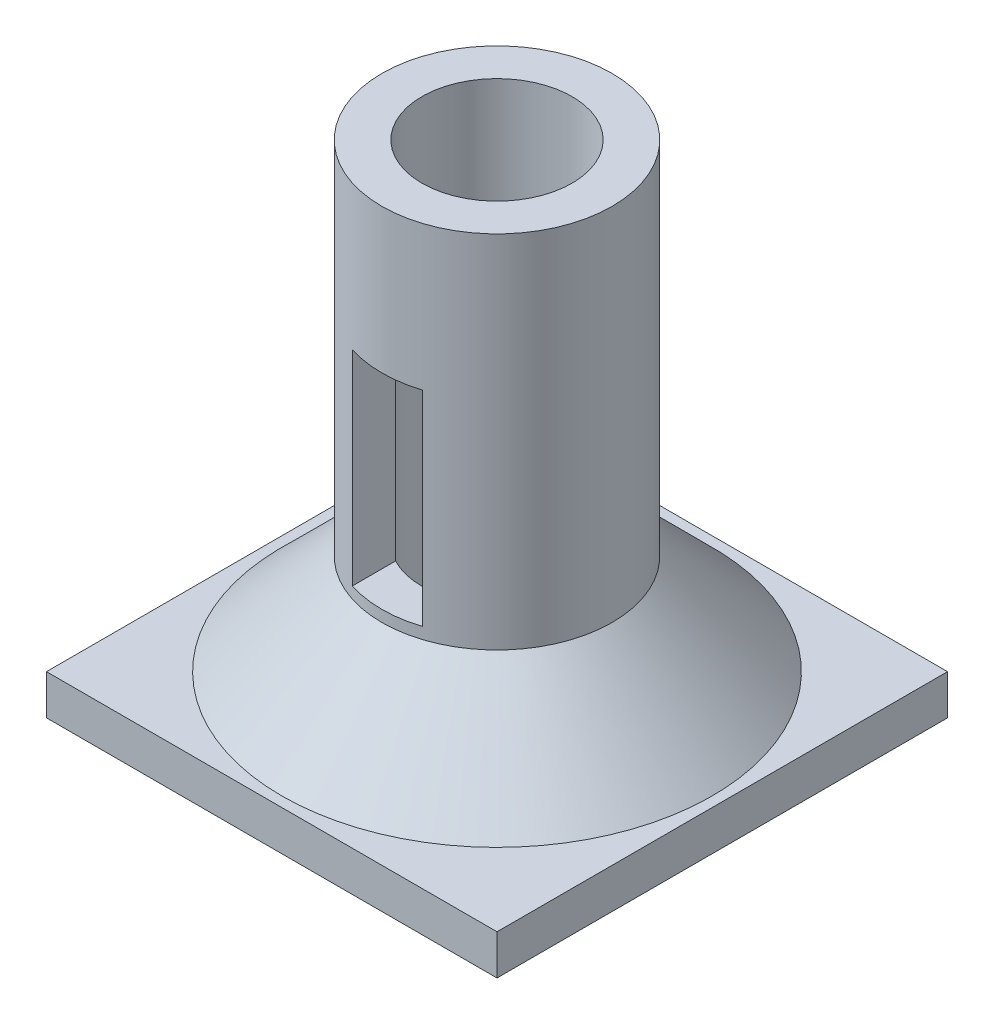
ISO-10303-21;
HEADER;
FILE_DESCRIPTION(('STEP AP214'),'2;1');
FILE_NAME('part.step','',(''),(''),'','','');
FILE_SCHEMA(('AUTOMOTIVE_DESIGN { 1 0 10303 214 1 1 1 1 }'));
ENDSEC;
DATA;
#1=APPLICATION_CONTEXT('core data for automotive mechanical design processes');
#2=APPLICATION_PROTOCOL_DEFINITION('international standard','automotive_design',2000,#1);
#3=PRODUCT_CONTEXT('',#1,'mechanical');
#4=PRODUCT('Part','Part','',(#3));
#5=PRODUCT_RELATED_PRODUCT_CATEGORY('part','',(#4));
#6=PRODUCT_DEFINITION_FORMATION('','',#4);
#7=PRODUCT_DEFINITION_CONTEXT('part definition',#1,'design');
#8=PRODUCT_DEFINITION('design','',#6,#7);
#9=PRODUCT_DEFINITION_SHAPE('','',#8);
#10=(LENGTH_UNIT() NAMED_UNIT(*) SI_UNIT(.MILLI.,.METRE.));
#11=(NAMED_UNIT(*) PLANE_ANGLE_UNIT() SI_UNIT($,.RADIAN.));
#12=(NAMED_UNIT(*) SI_UNIT($,.STERADIAN.) SOLID_ANGLE_UNIT());
#13=UNCERTAINTY_MEASURE_WITH_UNIT(LENGTH_MEASURE(1.E-05),#10,'distance_accuracy_value','');
#14=(GEOMETRIC_REPRESENTATION_CONTEXT(3) GLOBAL_UNCERTAINTY_ASSIGNED_CONTEXT((#13)) GLOBAL_UNIT_ASSIGNED_CONTEXT((#10,
#11,#12)) REPRESENTATION_CONTEXT('',''));
#15=CARTESIAN_POINT('',(0.,0.,0.));
#16=DIRECTION('',(0.,0.,1.));
#17=DIRECTION('',(1.,0.,0.));
#18=AXIS2_PLACEMENT_3D('',#15,#16,#17);
#19=CARTESIAN_POINT('',(0.,46.,0.));
#20=DIRECTION('',(0.,-1.,0.));
#21=DIRECTION('',(0.,0.,-1.));
#22=AXIS2_PLACEMENT_3D('',#19,#20,#21);
#23=CYLINDRICAL_SURFACE('',#22,7.5);
#24=CARTESIAN_POINT('',(0.,46.,0.));
#25=DIRECTION('',(0.,1.,0.));
#26=DIRECTION('',(0.,0.,1.));
#27=AXIS2_PLACEMENT_3D('',#24,#25,#26);
#28=CIRCLE('',#27,7.5);
#29=CARTESIAN_POINT('',(0.,46.,7.5));
#30=VERTEX_POINT('',#29);
#31=EDGE_CURVE('E163',#30,#30,#28,.T.);
#32=ORIENTED_EDGE('',*,*,#31,.T.);
#33=EDGE_LOOP('',(#32));
#34=FACE_BOUND('',#33,.T.);
#35=CARTESIAN_POINT('',(0.,0.,0.));
#36=DIRECTION('',(0.,1.,0.));
#37=DIRECTION('',(0.,0.,1.));
#38=AXIS2_PLACEMENT_3D('',#35,#36,#37);
#39=CIRCLE('',#38,7.5);
#40=CARTESIAN_POINT('',(0.,0.,7.5));
#41=VERTEX_POINT('',#40);
#42=EDGE_CURVE('E127',#41,#41,#39,.F.);
#43=ORIENTED_EDGE('',*,*,#42,.T.);
#44=EDGE_LOOP('',(#43));
#45=FACE_BOUND('',#44,.T.);
#46=CARTESIAN_POINT('',(0.,31.5880539918233,0.));
#47=DIRECTION('',(0.,-1.,0.));
#48=DIRECTION('',(1.,0.,0.));
#49=AXIS2_PLACEMENT_3D('',#46,#47,#48);
#50=CIRCLE('',#49,7.5);
#51=CARTESIAN_POINT('',(3.5,31.5880539918233,6.6332495807108));
#52=VERTEX_POINT('',#51);
#53=CARTESIAN_POINT('',(-3.5,31.5880539918233,6.6332495807108));
#54=VERTEX_POINT('',#53);
#55=EDGE_CURVE('E173',#52,#54,#50,.T.);
#56=ORIENTED_EDGE('',*,*,#55,.T.);
#57=DIRECTION('',(0.,-1.,0.));
#58=VECTOR('',#57,1.);
#59=CARTESIAN_POINT('',(-3.5,46.,6.6332495807108));
#60=LINE('',#59,#58);
#61=CARTESIAN_POINT('',(-3.5,11.1371551856989,6.6332495807108));
#62=VERTEX_POINT('',#61);
#63=EDGE_CURVE('E112',#54,#62,#60,.T.);
#64=ORIENTED_EDGE('',*,*,#63,.T.);
#65=CARTESIAN_POINT('',(0.,11.1371551856989,0.));
#66=DIRECTION('',(0.,1.,0.));
#67=DIRECTION('',(0.,0.,1.));
#68=AXIS2_PLACEMENT_3D('',#65,#66,#67);
#69=CIRCLE('',#68,7.5);
#70=CARTESIAN_POINT('',(3.5,11.1371551856989,6.6332495807108));
#71=VERTEX_POINT('',#70);
#72=EDGE_CURVE('E167',#62,#71,#69,.T.);
#73=ORIENTED_EDGE('',*,*,#72,.T.);
#74=DIRECTION('',(0.,-1.,0.));
#75=VECTOR('',#74,1.);
#76=CARTESIAN_POINT('',(3.5,46.,6.6332495807108));
#77=LINE('',#76,#75);
#78=EDGE_CURVE('E170',#71,#52,#77,.F.);
#79=ORIENTED_EDGE('',*,*,#78,.T.);
#80=EDGE_LOOP('',(#56,#64,#73,#79));
#81=FACE_BOUND('',#80,.T.);
#82=ADVANCED_FACE('F37',(#34,#45,#81),#23,.F.);
#83=CARTESIAN_POINT('',(0.,46.,0.));
#84=DIRECTION('',(0.,-1.,0.));
#85=DIRECTION('',(0.,0.,-1.));
#86=AXIS2_PLACEMENT_3D('',#83,#84,#85);
#87=CYLINDRICAL_SURFACE('',#86,11.5);
#88=CARTESIAN_POINT('',(0.,46.,0.));
#89=DIRECTION('',(0.,1.,0.));
#90=DIRECTION('',(0.,0.,1.));
#91=AXIS2_PLACEMENT_3D('',#88,#89,#90);
#92=CIRCLE('',#91,11.5);
#93=CARTESIAN_POINT('',(0.,46.,11.5));
#94=VERTEX_POINT('',#93);
#95=EDGE_CURVE('E152',#94,#94,#92,.T.);
#96=ORIENTED_EDGE('',*,*,#95,.F.);
#97=EDGE_LOOP('',(#96));
#98=FACE_BOUND('',#97,.T.);
#99=CARTESIAN_POINT('',(0.,10.0000000000001,0.));
#100=DIRECTION('',(0.,1.,0.));
#101=DIRECTION('',(0.,0.,1.));
#102=AXIS2_PLACEMENT_3D('',#99,#100,#101);
#103=CIRCLE('',#102,11.5);
#104=CARTESIAN_POINT('',(0.,10.0000000000001,11.5));
#105=VERTEX_POINT('',#104);
#106=EDGE_CURVE('E124',#105,#105,#103,.T.);
#107=ORIENTED_EDGE('',*,*,#106,.T.);
#108=EDGE_LOOP('',(#107));
#109=FACE_BOUND('',#108,.T.);
#110=DIRECTION('',(0.,-1.,0.));
#111=VECTOR('',#110,1.);
#112=CARTESIAN_POINT('',(-3.5,46.,10.9544511501033));
#113=LINE('',#112,#111);
#114=CARTESIAN_POINT('',(-3.5,31.5880539918233,10.9544511501033));
#115=VERTEX_POINT('',#114);
#116=CARTESIAN_POINT('',(-3.5,11.1371551856989,10.9544511501033));
#117=VERTEX_POINT('',#116);
#118=EDGE_CURVE('E11',#115,#117,#113,.T.);
#119=ORIENTED_EDGE('',*,*,#118,.F.);
#120=CARTESIAN_POINT('',(0.,31.5880539918233,0.));
#121=DIRECTION('',(0.,-1.,0.));
#122=DIRECTION('',(1.,0.,0.));
#123=AXIS2_PLACEMENT_3D('',#120,#121,#122);
#124=CIRCLE('',#123,11.5);
#125=CARTESIAN_POINT('',(3.5,31.5880539918233,10.9544511501033));
#126=VERTEX_POINT('',#125);
#127=EDGE_CURVE('E99',#126,#115,#124,.T.);
#128=ORIENTED_EDGE('',*,*,#127,.F.);
#129=DIRECTION('',(0.,-1.,0.));
#130=VECTOR('',#129,1.);
#131=CARTESIAN_POINT('',(3.5,46.,10.9544511501033));
#132=LINE('',#131,#130);
#133=CARTESIAN_POINT('',(3.5,11.1371551856989,10.9544511501033));
#134=VERTEX_POINT('',#133);
#135=EDGE_CURVE('E104',#134,#126,#132,.F.);
#136=ORIENTED_EDGE('',*,*,#135,.F.);
#137=CARTESIAN_POINT('',(0.,11.1371551856989,0.));
#138=DIRECTION('',(0.,1.,0.));
#139=DIRECTION('',(0.,0.,1.));
#140=AXIS2_PLACEMENT_3D('',#137,#138,#139);
#141=CIRCLE('',#140,11.5);
#142=EDGE_CURVE('E46',#117,#134,#141,.T.);
#143=ORIENTED_EDGE('',*,*,#142,.F.);
#144=EDGE_LOOP('',(#119,#128,#136,#143));
#145=FACE_BOUND('',#144,.T.);
#146=ADVANCED_FACE('F116',(#98,#109,#145),#87,.T.);
#147=CARTESIAN_POINT('',(22.5,-4.,0.));
#148=DIRECTION('',(-1.,0.,0.));
#149=DIRECTION('',(0.,0.,1.));
#150=AXIS2_PLACEMENT_3D('',#147,#148,#149);
#151=PLANE('',#150);
#152=DIRECTION('',(0.,0.,1.));
#153=VECTOR('',#152,1.);
#154=CARTESIAN_POINT('',(22.5,0.,0.));
#155=LINE('',#154,#153);
#156=CARTESIAN_POINT('',(22.5,0.,-22.5));
#157=VERTEX_POINT('',#156);
#158=CARTESIAN_POINT('',(22.5,0.,22.5));
#159=VERTEX_POINT('',#158);
#160=EDGE_CURVE('E149',#157,#159,#155,.T.);
#161=ORIENTED_EDGE('',*,*,#160,.T.);
#162=DIRECTION('',(0.,1.,0.));
#163=VECTOR('',#162,1.);
#164=CARTESIAN_POINT('',(22.5,-4.,22.5));
#165=LINE('',#164,#163);
#166=CARTESIAN_POINT('',(22.5,-4.,22.5));
#167=VERTEX_POINT('',#166);
#168=EDGE_CURVE('E130',#167,#159,#165,.T.);
#169=ORIENTED_EDGE('',*,*,#168,.F.);
#170=DIRECTION('',(0.,0.,1.));
#171=VECTOR('',#170,1.);
#172=CARTESIAN_POINT('',(22.5,-4.,0.));
#173=LINE('',#172,#171);
#174=CARTESIAN_POINT('',(22.5,-4.,-22.5));
#175=VERTEX_POINT('',#174);
#176=EDGE_CURVE('E143',#175,#167,#173,.T.);
#177=ORIENTED_EDGE('',*,*,#176,.F.);
#178=DIRECTION('',(0.,1.,0.));
#179=VECTOR('',#178,1.);
#180=CARTESIAN_POINT('',(22.5,-4.,-22.5));
#181=LINE('',#180,#179);
#182=EDGE_CURVE('E131',#175,#157,#181,.T.);
#183=ORIENTED_EDGE('',*,*,#182,.T.);
#184=EDGE_LOOP('',(#161,#169,#177,#183));
#185=FACE_BOUND('',#184,.T.);
#186=ADVANCED_FACE('F197',(#185),#151,.F.);
#187=CARTESIAN_POINT('',(0.,-4.,22.5));
#188=DIRECTION('',(0.,0.,1.));
#189=DIRECTION('',(1.,0.,0.));
#190=AXIS2_PLACEMENT_3D('',#187,#188,#189);
#191=PLANE('',#190);
#192=DIRECTION('',(1.,0.,0.));
#193=VECTOR('',#192,1.);
#194=CARTESIAN_POINT('',(0.,0.,22.5));
#195=LINE('',#194,#193);
#196=CARTESIAN_POINT('',(-22.5,0.,22.5));
#197=VERTEX_POINT('',#196);
#198=EDGE_CURVE('E140',#197,#159,#195,.T.);
#199=ORIENTED_EDGE('',*,*,#198,.F.);
#200=DIRECTION('',(0.,1.,0.));
#201=VECTOR('',#200,1.);
#202=CARTESIAN_POINT('',(-22.5,-4.,22.5));
#203=LINE('',#202,#201);
#204=CARTESIAN_POINT('',(-22.5,-4.,22.5));
#205=VERTEX_POINT('',#204);
#206=EDGE_CURVE('E137',#205,#197,#203,.T.);
#207=ORIENTED_EDGE('',*,*,#206,.F.);
#208=DIRECTION('',(1.,0.,0.));
#209=VECTOR('',#208,1.);
#210=CARTESIAN_POINT('',(0.,-4.,22.5));
#211=LINE('',#210,#209);
#212=EDGE_CURVE('E135',#205,#167,#211,.T.);
#213=ORIENTED_EDGE('',*,*,#212,.T.);
#214=ORIENTED_EDGE('',*,*,#168,.T.);
#215=EDGE_LOOP('',(#199,#207,#213,#214));
#216=FACE_BOUND('',#215,.T.);
#217=ADVANCED_FACE('F214',(#216),#191,.T.);
#218=CARTESIAN_POINT('',(-22.5,-4.,0.));
#219=DIRECTION('',(-1.,0.,0.));
#220=DIRECTION('',(0.,0.,1.));
#221=AXIS2_PLACEMENT_3D('',#218,#219,#220);
#222=PLANE('',#221);
#223=DIRECTION('',(0.,0.,1.));
#224=VECTOR('',#223,1.);
#225=CARTESIAN_POINT('',(-22.5,0.,0.));
#226=LINE('',#225,#224);
#227=CARTESIAN_POINT('',(-22.5,0.,-22.5));
#228=VERTEX_POINT('',#227);
#229=EDGE_CURVE('E144',#228,#197,#226,.T.);
#230=ORIENTED_EDGE('',*,*,#229,.F.);
#231=DIRECTION('',(0.,1.,0.));
#232=VECTOR('',#231,1.);
#233=CARTESIAN_POINT('',(-22.5,-4.,-22.5));
#234=LINE('',#233,#232);
#235=CARTESIAN_POINT('',(-22.5,-4.,-22.5));
#236=VERTEX_POINT('',#235);
#237=EDGE_CURVE('E134',#236,#228,#234,.T.);
#238=ORIENTED_EDGE('',*,*,#237,.F.);
#239=DIRECTION('',(0.,0.,1.));
#240=VECTOR('',#239,1.);
#241=CARTESIAN_POINT('',(-22.5,-4.,0.));
#242=LINE('',#241,#240);
#243=EDGE_CURVE('E155',#236,#205,#242,.T.);
#244=ORIENTED_EDGE('',*,*,#243,.T.);
#245=ORIENTED_EDGE('',*,*,#206,.T.);
#246=EDGE_LOOP('',(#230,#238,#244,#245));
#247=FACE_BOUND('',#246,.T.);
#248=ADVANCED_FACE('F217',(#247),#222,.T.);
#249=CARTESIAN_POINT('',(0.,-4.,-22.5));
#250=DIRECTION('',(0.,0.,1.));
#251=DIRECTION('',(1.,0.,0.));
#252=AXIS2_PLACEMENT_3D('',#249,#250,#251);
#253=PLANE('',#252);
#254=DIRECTION('',(1.,0.,0.));
#255=VECTOR('',#254,1.);
#256=CARTESIAN_POINT('',(0.,0.,-22.5));
#257=LINE('',#256,#255);
#258=EDGE_CURVE('E147',#228,#157,#257,.T.);
#259=ORIENTED_EDGE('',*,*,#258,.T.);
#260=ORIENTED_EDGE('',*,*,#182,.F.);
#261=DIRECTION('',(1.,0.,0.));
#262=VECTOR('',#261,1.);
#263=CARTESIAN_POINT('',(0.,-4.,-22.5));
#264=LINE('',#263,#262);
#265=EDGE_CURVE('E158',#236,#175,#264,.T.);
#266=ORIENTED_EDGE('',*,*,#265,.F.);
#267=ORIENTED_EDGE('',*,*,#237,.T.);
#268=EDGE_LOOP('',(#259,#260,#266,#267));
#269=FACE_BOUND('',#268,.T.);
#270=ADVANCED_FACE('F207',(#269),#253,.F.);
#271=CARTESIAN_POINT('',(0.,-4.,0.));
#272=DIRECTION('',(0.,1.,0.));
#273=DIRECTION('',(0.,0.,1.));
#274=AXIS2_PLACEMENT_3D('',#271,#272,#273);
#275=PLANE('',#274);
#276=ORIENTED_EDGE('',*,*,#176,.T.);
#277=ORIENTED_EDGE('',*,*,#212,.F.);
#278=ORIENTED_EDGE('',*,*,#243,.F.);
#279=ORIENTED_EDGE('',*,*,#265,.T.);
#280=EDGE_LOOP('',(#276,#277,#278,#279));
#281=FACE_BOUND('',#280,.T.);
#282=ADVANCED_FACE('F203',(#281),#275,.F.);
#283=CARTESIAN_POINT('',(0.,0.,0.));
#284=DIRECTION('',(0.,1.,0.));
#285=DIRECTION('',(0.,0.,1.));
#286=AXIS2_PLACEMENT_3D('',#283,#284,#285);
#287=PLANE('',#286);
#288=CARTESIAN_POINT('',(0.,0.,0.));
#289=DIRECTION('',(0.,1.,0.));
#290=DIRECTION('',(0.,0.,1.));
#291=AXIS2_PLACEMENT_3D('',#288,#289,#290);
#292=CIRCLE('',#291,21.5);
#293=CARTESIAN_POINT('',(0.,0.,21.5));
#294=VERTEX_POINT('',#293);
#295=EDGE_CURVE('E105',#294,#294,#292,.F.);
#296=ORIENTED_EDGE('',*,*,#295,.T.);
#297=EDGE_LOOP('',(#296));
#298=FACE_BOUND('',#297,.T.);
#299=ORIENTED_EDGE('',*,*,#160,.F.);
#300=ORIENTED_EDGE('',*,*,#258,.F.);
#301=ORIENTED_EDGE('',*,*,#229,.T.);
#302=ORIENTED_EDGE('',*,*,#198,.T.);
#303=EDGE_LOOP('',(#299,#300,#301,#302));
#304=FACE_BOUND('',#303,.T.);
#305=ADVANCED_FACE('F206',(#298,#304),#287,.T.);
#306=CARTESIAN_POINT('',(0.,46.,0.));
#307=DIRECTION('',(0.,1.,0.));
#308=DIRECTION('',(0.,0.,1.));
#309=AXIS2_PLACEMENT_3D('',#306,#307,#308);
#310=PLANE('',#309);
#311=ORIENTED_EDGE('',*,*,#31,.F.);
#312=EDGE_LOOP('',(#311));
#313=FACE_BOUND('',#312,.T.);
#314=ORIENTED_EDGE('',*,*,#95,.T.);
#315=EDGE_LOOP('',(#314));
#316=FACE_BOUND('',#315,.T.);
#317=ADVANCED_FACE('F211',(#313,#316),#310,.T.);
#318=ORIENTED_EDGE('',*,*,#42,.F.);
#319=EDGE_LOOP('',(#318));
#320=FACE_BOUND('',#319,.T.);
#321=ADVANCED_FACE('F213',(#320),#287,.T.);
#322=CARTESIAN_POINT('',(0.,10.0000000000001,0.));
#323=DIRECTION('',(0.,-1.,0.));
#324=DIRECTION('',(0.,0.,-1.));
#325=AXIS2_PLACEMENT_3D('',#322,#323,#324);
#326=CONICAL_SURFACE('',#325,11.5,0.785398163397443);
#327=ORIENTED_EDGE('',*,*,#295,.F.);
#328=EDGE_LOOP('',(#327));
#329=FACE_BOUND('',#328,.T.);
#330=ORIENTED_EDGE('',*,*,#106,.F.);
#331=EDGE_LOOP('',(#330));
#332=FACE_BOUND('',#331,.T.);
#333=ADVANCED_FACE('F40',(#329,#332),#326,.T.);
#334=CARTESIAN_POINT('',(-3.5,31.5880539918233,19.));
#335=DIRECTION('',(1.,0.,0.));
#336=DIRECTION('',(0.,0.,-1.));
#337=AXIS2_PLACEMENT_3D('',#334,#335,#336);
#338=PLANE('',#337);
#339=DIRECTION('',(0.,0.,-1.));
#340=VECTOR('',#339,1.);
#341=CARTESIAN_POINT('',(-3.5,31.5880539918233,19.));
#342=LINE('',#341,#340);
#343=EDGE_CURVE('E53',#115,#54,#342,.T.);
#344=ORIENTED_EDGE('',*,*,#343,.F.);
#345=ORIENTED_EDGE('',*,*,#118,.T.);
#346=DIRECTION('',(0.,0.,-1.));
#347=VECTOR('',#346,1.);
#348=CARTESIAN_POINT('',(-3.5,11.1371551856989,19.));
#349=LINE('',#348,#347);
#350=EDGE_CURVE('E175',#117,#62,#349,.T.);
#351=ORIENTED_EDGE('',*,*,#350,.T.);
#352=ORIENTED_EDGE('',*,*,#63,.F.);
#353=EDGE_LOOP('',(#344,#345,#351,#352));
#354=FACE_BOUND('',#353,.T.);
#355=ADVANCED_FACE('F108',(#354),#338,.T.);
#356=CARTESIAN_POINT('',(-3.5,11.1371551856989,19.));
#357=DIRECTION('',(0.,1.,0.));
#358=DIRECTION('',(0.,0.,1.));
#359=AXIS2_PLACEMENT_3D('',#356,#357,#358);
#360=PLANE('',#359);
#361=ORIENTED_EDGE('',*,*,#350,.F.);
#362=ORIENTED_EDGE('',*,*,#142,.T.);
#363=DIRECTION('',(0.,0.,-1.));
#364=VECTOR('',#363,1.);
#365=CARTESIAN_POINT('',(3.5,11.1371551856989,19.));
#366=LINE('',#365,#364);
#367=EDGE_CURVE('E177',#134,#71,#366,.T.);
#368=ORIENTED_EDGE('',*,*,#367,.T.);
#369=ORIENTED_EDGE('',*,*,#72,.F.);
#370=EDGE_LOOP('',(#361,#362,#368,#369));
#371=FACE_BOUND('',#370,.T.);
#372=ADVANCED_FACE('F182',(#371),#360,.T.);
#373=CARTESIAN_POINT('',(3.5,31.5880539918233,19.));
#374=DIRECTION('',(-1.,0.,0.));
#375=DIRECTION('',(0.,-1.,0.));
#376=AXIS2_PLACEMENT_3D('',#373,#374,#375);
#377=PLANE('',#376);
#378=ORIENTED_EDGE('',*,*,#367,.F.);
#379=ORIENTED_EDGE('',*,*,#135,.T.);
#380=DIRECTION('',(0.,0.,-1.));
#381=VECTOR('',#380,1.);
#382=CARTESIAN_POINT('',(3.5,31.5880539918233,19.));
#383=LINE('',#382,#381);
#384=EDGE_CURVE('E58',#126,#52,#383,.T.);
#385=ORIENTED_EDGE('',*,*,#384,.T.);
#386=ORIENTED_EDGE('',*,*,#78,.F.);
#387=EDGE_LOOP('',(#378,#379,#385,#386));
#388=FACE_BOUND('',#387,.T.);
#389=ADVANCED_FACE('F180',(#388),#377,.T.);
#390=CARTESIAN_POINT('',(-3.5,31.5880539918233,19.));
#391=DIRECTION('',(0.,-1.,0.));
#392=DIRECTION('',(1.,0.,0.));
#393=AXIS2_PLACEMENT_3D('',#390,#391,#392);
#394=PLANE('',#393);
#395=ORIENTED_EDGE('',*,*,#384,.F.);
#396=ORIENTED_EDGE('',*,*,#127,.T.);
#397=ORIENTED_EDGE('',*,*,#343,.T.);
#398=ORIENTED_EDGE('',*,*,#55,.F.);
#399=EDGE_LOOP('',(#395,#396,#397,#398));
#400=FACE_BOUND('',#399,.T.);
#401=ADVANCED_FACE('F100',(#400),#394,.T.);
#402=CLOSED_SHELL('',(#82,#146,#186,#217,#248,#270,#282,#305,#317,#321,#333,#355,#372,#389,#401));
#403=MANIFOLD_SOLID_BREP('B2',#402);
#404=ADVANCED_BREP_SHAPE_REPRESENTATION('',(#18,#403),#14);
#405=SHAPE_DEFINITION_REPRESENTATION(#9,#404);
ENDSEC;
END-ISO-10303-21;
